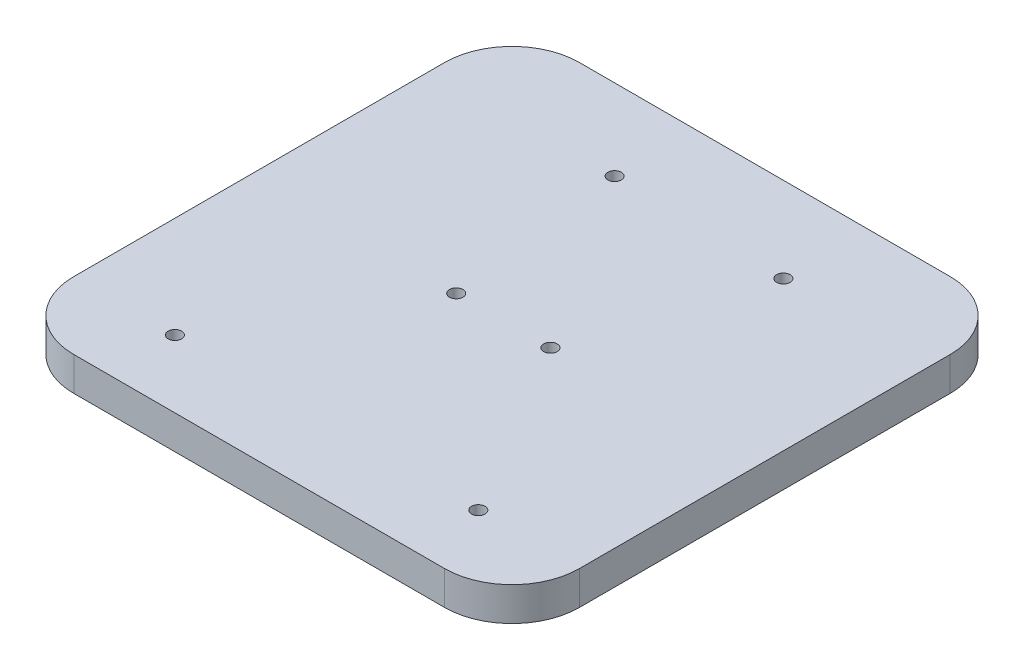
ISO-10303-21;
HEADER;
FILE_DESCRIPTION(('STEP AP214'),'2;1');
FILE_NAME('part.step','',(''),(''),'','','');
FILE_SCHEMA(('AUTOMOTIVE_DESIGN { 1 0 10303 214 1 1 1 1 }'));
ENDSEC;
DATA;
#1=APPLICATION_CONTEXT('core data for automotive mechanical design processes');
#2=APPLICATION_PROTOCOL_DEFINITION('international standard','automotive_design',2000,#1);
#3=PRODUCT_CONTEXT('',#1,'mechanical');
#4=PRODUCT('Part','Part','',(#3));
#5=PRODUCT_RELATED_PRODUCT_CATEGORY('part','',(#4));
#6=PRODUCT_DEFINITION_FORMATION('','',#4);
#7=PRODUCT_DEFINITION_CONTEXT('part definition',#1,'design');
#8=PRODUCT_DEFINITION('design','',#6,#7);
#9=PRODUCT_DEFINITION_SHAPE('','',#8);
#10=(LENGTH_UNIT() NAMED_UNIT(*) SI_UNIT(.MILLI.,.METRE.));
#11=(NAMED_UNIT(*) PLANE_ANGLE_UNIT() SI_UNIT($,.RADIAN.));
#12=(NAMED_UNIT(*) SI_UNIT($,.STERADIAN.) SOLID_ANGLE_UNIT());
#13=UNCERTAINTY_MEASURE_WITH_UNIT(LENGTH_MEASURE(1.E-05),#10,'distance_accuracy_value','');
#14=(GEOMETRIC_REPRESENTATION_CONTEXT(3) GLOBAL_UNCERTAINTY_ASSIGNED_CONTEXT((#13)) GLOBAL_UNIT_ASSIGNED_CONTEXT((#10,
#11,#12)) REPRESENTATION_CONTEXT('',''));
#15=CARTESIAN_POINT('',(0.,0.,0.));
#16=DIRECTION('',(0.,0.,1.));
#17=DIRECTION('',(1.,0.,0.));
#18=AXIS2_PLACEMENT_3D('',#15,#16,#17);
#19=CARTESIAN_POINT('',(30.,10.,-20.));
#20=DIRECTION('',(0.,-1.,0.));
#21=DIRECTION('',(0.,0.,-1.));
#22=AXIS2_PLACEMENT_3D('',#19,#20,#21);
#23=CYLINDRICAL_SURFACE('',#22,2.);
#24=CARTESIAN_POINT('',(30.,10.,-20.));
#25=DIRECTION('',(0.,1.,0.));
#26=DIRECTION('',(0.,0.,1.));
#27=AXIS2_PLACEMENT_3D('',#24,#25,#26);
#28=CIRCLE('',#27,2.);
#29=CARTESIAN_POINT('',(30.,10.,-18.));
#30=VERTEX_POINT('',#29);
#31=EDGE_CURVE('E136',#30,#30,#28,.T.);
#32=ORIENTED_EDGE('',*,*,#31,.T.);
#33=EDGE_LOOP('',(#32));
#34=FACE_BOUND('',#33,.T.);
#35=CARTESIAN_POINT('',(30.,5.,-20.));
#36=DIRECTION('',(0.,-1.,0.));
#37=DIRECTION('',(0.,0.,-1.));
#38=AXIS2_PLACEMENT_3D('',#35,#36,#37);
#39=CIRCLE('',#38,2.);
#40=CARTESIAN_POINT('',(30.,5.,-22.));
#41=VERTEX_POINT('',#40);
#42=EDGE_CURVE('E176',#41,#41,#39,.T.);
#43=ORIENTED_EDGE('',*,*,#42,.T.);
#44=EDGE_LOOP('',(#43));
#45=FACE_BOUND('',#44,.T.);
#46=ADVANCED_FACE('F39',(#34,#45),#23,.F.);
#47=CARTESIAN_POINT('',(120.,10.,-20.));
#48=DIRECTION('',(0.,-1.,0.));
#49=DIRECTION('',(0.,0.,-1.));
#50=AXIS2_PLACEMENT_3D('',#47,#48,#49);
#51=CYLINDRICAL_SURFACE('',#50,2.);
#52=CARTESIAN_POINT('',(120.,10.,-20.));
#53=DIRECTION('',(0.,1.,0.));
#54=DIRECTION('',(0.,0.,1.));
#55=AXIS2_PLACEMENT_3D('',#52,#53,#54);
#56=CIRCLE('',#55,2.);
#57=CARTESIAN_POINT('',(120.,10.,-18.));
#58=VERTEX_POINT('',#57);
#59=EDGE_CURVE('E144',#58,#58,#56,.T.);
#60=ORIENTED_EDGE('',*,*,#59,.T.);
#61=EDGE_LOOP('',(#60));
#62=FACE_BOUND('',#61,.T.);
#63=CARTESIAN_POINT('',(120.,5.,-20.));
#64=DIRECTION('',(0.,-1.,0.));
#65=DIRECTION('',(0.,0.,-1.));
#66=AXIS2_PLACEMENT_3D('',#63,#64,#65);
#67=CIRCLE('',#66,2.);
#68=CARTESIAN_POINT('',(120.,5.,-22.));
#69=VERTEX_POINT('',#68);
#70=EDGE_CURVE('E172',#69,#69,#67,.T.);
#71=ORIENTED_EDGE('',*,*,#70,.T.);
#72=EDGE_LOOP('',(#71));
#73=FACE_BOUND('',#72,.T.);
#74=ADVANCED_FACE('F342',(#62,#73),#51,.F.);
#75=CARTESIAN_POINT('',(61.03,10.,-72.42));
#76=DIRECTION('',(0.,-1.,0.));
#77=DIRECTION('',(0.,0.,-1.));
#78=AXIS2_PLACEMENT_3D('',#75,#76,#77);
#79=CYLINDRICAL_SURFACE('',#78,2.);
#80=CARTESIAN_POINT('',(61.03,10.,-72.42));
#81=DIRECTION('',(0.,1.,0.));
#82=DIRECTION('',(0.,0.,1.));
#83=AXIS2_PLACEMENT_3D('',#80,#81,#82);
#84=CIRCLE('',#83,2.);
#85=CARTESIAN_POINT('',(61.03,10.,-70.42));
#86=VERTEX_POINT('',#85);
#87=EDGE_CURVE('E239',#86,#86,#84,.T.);
#88=ORIENTED_EDGE('',*,*,#87,.T.);
#89=EDGE_LOOP('',(#88));
#90=FACE_BOUND('',#89,.T.);
#91=CARTESIAN_POINT('',(61.03,5.,-72.42));
#92=DIRECTION('',(0.,-1.,0.));
#93=DIRECTION('',(0.,0.,-1.));
#94=AXIS2_PLACEMENT_3D('',#91,#92,#93);
#95=CIRCLE('',#94,2.);
#96=CARTESIAN_POINT('',(61.03,5.,-74.42));
#97=VERTEX_POINT('',#96);
#98=EDGE_CURVE('E168',#97,#97,#95,.T.);
#99=ORIENTED_EDGE('',*,*,#98,.T.);
#100=EDGE_LOOP('',(#99));
#101=FACE_BOUND('',#100,.T.);
#102=ADVANCED_FACE('F348',(#90,#101),#79,.F.);
#103=CARTESIAN_POINT('',(88.97,10.,-72.42));
#104=DIRECTION('',(0.,-1.,0.));
#105=DIRECTION('',(0.,0.,-1.));
#106=AXIS2_PLACEMENT_3D('',#103,#104,#105);
#107=CYLINDRICAL_SURFACE('',#106,2.);
#108=CARTESIAN_POINT('',(88.97,10.,-72.42));
#109=DIRECTION('',(0.,1.,0.));
#110=DIRECTION('',(0.,0.,1.));
#111=AXIS2_PLACEMENT_3D('',#108,#109,#110);
#112=CIRCLE('',#111,2.);
#113=CARTESIAN_POINT('',(88.97,10.,-70.42));
#114=VERTEX_POINT('',#113);
#115=EDGE_CURVE('E243',#114,#114,#112,.T.);
#116=ORIENTED_EDGE('',*,*,#115,.T.);
#117=EDGE_LOOP('',(#116));
#118=FACE_BOUND('',#117,.T.);
#119=CARTESIAN_POINT('',(88.97,5.,-72.42));
#120=DIRECTION('',(0.,-1.,0.));
#121=DIRECTION('',(0.,0.,-1.));
#122=AXIS2_PLACEMENT_3D('',#119,#120,#121);
#123=CIRCLE('',#122,2.);
#124=CARTESIAN_POINT('',(88.97,5.,-74.42));
#125=VERTEX_POINT('',#124);
#126=EDGE_CURVE('E164',#125,#125,#123,.T.);
#127=ORIENTED_EDGE('',*,*,#126,.T.);
#128=EDGE_LOOP('',(#127));
#129=FACE_BOUND('',#128,.T.);
#130=ADVANCED_FACE('F416',(#118,#129),#107,.F.);
#131=CARTESIAN_POINT('',(105.74,10.,-124.76));
#132=DIRECTION('',(0.,-1.,0.));
#133=DIRECTION('',(0.,0.,-1.));
#134=AXIS2_PLACEMENT_3D('',#131,#132,#133);
#135=CYLINDRICAL_SURFACE('',#134,1.99999999999998);
#136=CARTESIAN_POINT('',(105.74,10.,-124.76));
#137=DIRECTION('',(0.,1.,0.));
#138=DIRECTION('',(0.,0.,1.));
#139=AXIS2_PLACEMENT_3D('',#136,#137,#138);
#140=CIRCLE('',#139,1.99999999999998);
#141=CARTESIAN_POINT('',(105.74,10.,-122.76));
#142=VERTEX_POINT('',#141);
#143=EDGE_CURVE('E247',#142,#142,#140,.T.);
#144=ORIENTED_EDGE('',*,*,#143,.T.);
#145=EDGE_LOOP('',(#144));
#146=FACE_BOUND('',#145,.T.);
#147=CARTESIAN_POINT('',(105.74,5.,-124.76));
#148=DIRECTION('',(0.,-1.,0.));
#149=DIRECTION('',(0.,0.,-1.));
#150=AXIS2_PLACEMENT_3D('',#147,#148,#149);
#151=CIRCLE('',#150,1.99999999999998);
#152=CARTESIAN_POINT('',(105.74,5.,-126.76));
#153=VERTEX_POINT('',#152);
#154=EDGE_CURVE('E159',#153,#153,#151,.T.);
#155=ORIENTED_EDGE('',*,*,#154,.T.);
#156=EDGE_LOOP('',(#155));
#157=FACE_BOUND('',#156,.T.);
#158=ADVANCED_FACE('F396',(#146,#157),#135,.F.);
#159=CARTESIAN_POINT('',(54.4,10.,-126.03));
#160=DIRECTION('',(0.,-1.,0.));
#161=DIRECTION('',(0.,0.,-1.));
#162=AXIS2_PLACEMENT_3D('',#159,#160,#161);
#163=CYLINDRICAL_SURFACE('',#162,2.);
#164=CARTESIAN_POINT('',(54.4,10.,-126.03));
#165=DIRECTION('',(0.,1.,0.));
#166=DIRECTION('',(0.,0.,1.));
#167=AXIS2_PLACEMENT_3D('',#164,#165,#166);
#168=CIRCLE('',#167,2.);
#169=CARTESIAN_POINT('',(54.4,10.,-124.03));
#170=VERTEX_POINT('',#169);
#171=EDGE_CURVE('E180',#170,#170,#168,.T.);
#172=ORIENTED_EDGE('',*,*,#171,.T.);
#173=EDGE_LOOP('',(#172));
#174=FACE_BOUND('',#173,.T.);
#175=CARTESIAN_POINT('',(54.4,5.,-126.03));
#176=DIRECTION('',(0.,-1.,0.));
#177=DIRECTION('',(0.,0.,-1.));
#178=AXIS2_PLACEMENT_3D('',#175,#176,#177);
#179=CIRCLE('',#178,2.);
#180=CARTESIAN_POINT('',(54.4,5.,-128.03));
#181=VERTEX_POINT('',#180);
#182=EDGE_CURVE('E155',#181,#181,#179,.T.);
#183=ORIENTED_EDGE('',*,*,#182,.T.);
#184=EDGE_LOOP('',(#183));
#185=FACE_BOUND('',#184,.T.);
#186=ADVANCED_FACE('F355',(#174,#185),#163,.F.);
#187=CARTESIAN_POINT('',(0.,10.,0.));
#188=DIRECTION('',(0.,-1.,0.));
#189=DIRECTION('',(0.,0.,-1.));
#190=AXIS2_PLACEMENT_3D('',#187,#188,#189);
#191=PLANE('',#190);
#192=DIRECTION('',(-1.,0.,0.));
#193=VECTOR('',#192,1.);
#194=CARTESIAN_POINT('',(0.,10.,-150.));
#195=LINE('',#194,#193);
#196=CARTESIAN_POINT('',(130.,10.,-150.));
#197=VERTEX_POINT('',#196);
#198=CARTESIAN_POINT('',(20.,10.,-150.));
#199=VERTEX_POINT('',#198);
#200=EDGE_CURVE('E147',#197,#199,#195,.T.);
#201=ORIENTED_EDGE('',*,*,#200,.T.);
#202=CARTESIAN_POINT('',(20.,10.,-130.));
#203=DIRECTION('',(0.,-1.,0.));
#204=DIRECTION('',(0.,0.,-1.));
#205=AXIS2_PLACEMENT_3D('',#202,#203,#204);
#206=CIRCLE('',#205,20.);
#207=CARTESIAN_POINT('',(0.,10.,-130.));
#208=VERTEX_POINT('',#207);
#209=EDGE_CURVE('E203',#199,#208,#206,.F.);
#210=ORIENTED_EDGE('',*,*,#209,.T.);
#211=DIRECTION('',(0.,0.,1.));
#212=VECTOR('',#211,1.);
#213=CARTESIAN_POINT('',(0.,10.,0.));
#214=LINE('',#213,#212);
#215=CARTESIAN_POINT('',(0.,10.,-20.));
#216=VERTEX_POINT('',#215);
#217=EDGE_CURVE('E127',#208,#216,#214,.T.);
#218=ORIENTED_EDGE('',*,*,#217,.T.);
#219=CARTESIAN_POINT('',(20.,10.,-20.));
#220=DIRECTION('',(0.,-1.,0.));
#221=DIRECTION('',(0.,0.,-1.));
#222=AXIS2_PLACEMENT_3D('',#219,#220,#221);
#223=CIRCLE('',#222,20.);
#224=CARTESIAN_POINT('',(20.,10.,0.));
#225=VERTEX_POINT('',#224);
#226=EDGE_CURVE('E195',#216,#225,#223,.F.);
#227=ORIENTED_EDGE('',*,*,#226,.T.);
#228=DIRECTION('',(1.,0.,0.));
#229=VECTOR('',#228,1.);
#230=CARTESIAN_POINT('',(0.,10.,0.));
#231=LINE('',#230,#229);
#232=CARTESIAN_POINT('',(130.,10.,0.));
#233=VERTEX_POINT('',#232);
#234=EDGE_CURVE('E218',#225,#233,#231,.T.);
#235=ORIENTED_EDGE('',*,*,#234,.T.);
#236=CARTESIAN_POINT('',(130.,10.,-20.));
#237=DIRECTION('',(0.,-1.,0.));
#238=DIRECTION('',(0.,0.,-1.));
#239=AXIS2_PLACEMENT_3D('',#236,#237,#238);
#240=CIRCLE('',#239,20.);
#241=CARTESIAN_POINT('',(150.,10.,-20.));
#242=VERTEX_POINT('',#241);
#243=EDGE_CURVE('E62',#233,#242,#240,.F.);
#244=ORIENTED_EDGE('',*,*,#243,.T.);
#245=DIRECTION('',(0.,0.,-1.));
#246=VECTOR('',#245,1.);
#247=CARTESIAN_POINT('',(150.,10.,0.));
#248=LINE('',#247,#246);
#249=CARTESIAN_POINT('',(150.,10.,-130.));
#250=VERTEX_POINT('',#249);
#251=EDGE_CURVE('E226',#242,#250,#248,.T.);
#252=ORIENTED_EDGE('',*,*,#251,.T.);
#253=CARTESIAN_POINT('',(130.,10.,-130.));
#254=DIRECTION('',(0.,-1.,0.));
#255=DIRECTION('',(0.,0.,-1.));
#256=AXIS2_PLACEMENT_3D('',#253,#254,#255);
#257=CIRCLE('',#256,20.);
#258=EDGE_CURVE('E200',#250,#197,#257,.F.);
#259=ORIENTED_EDGE('',*,*,#258,.T.);
#260=EDGE_LOOP('',(#201,#210,#218,#227,#235,#244,#252,#259));
#261=FACE_BOUND('',#260,.T.);
#262=ORIENTED_EDGE('',*,*,#31,.F.);
#263=EDGE_LOOP('',(#262));
#264=FACE_BOUND('',#263,.T.);
#265=ORIENTED_EDGE('',*,*,#59,.F.);
#266=EDGE_LOOP('',(#265));
#267=FACE_BOUND('',#266,.T.);
#268=ORIENTED_EDGE('',*,*,#87,.F.);
#269=EDGE_LOOP('',(#268));
#270=FACE_BOUND('',#269,.T.);
#271=ORIENTED_EDGE('',*,*,#115,.F.);
#272=EDGE_LOOP('',(#271));
#273=FACE_BOUND('',#272,.T.);
#274=ORIENTED_EDGE('',*,*,#143,.F.);
#275=EDGE_LOOP('',(#274));
#276=FACE_BOUND('',#275,.T.);
#277=ORIENTED_EDGE('',*,*,#171,.F.);
#278=EDGE_LOOP('',(#277));
#279=FACE_BOUND('',#278,.T.);
#280=ADVANCED_FACE('F313',(#261,#264,#267,#270,#273,#276,#279),#191,.F.);
#281=CARTESIAN_POINT('',(0.,0.,0.));
#282=DIRECTION('',(0.,-1.,0.));
#283=DIRECTION('',(0.,0.,-1.));
#284=AXIS2_PLACEMENT_3D('',#281,#282,#283);
#285=PLANE('',#284);
#286=CARTESIAN_POINT('',(30.,0.,-20.));
#287=DIRECTION('',(0.,-1.,0.));
#288=DIRECTION('',(0.,0.,-1.));
#289=AXIS2_PLACEMENT_3D('',#286,#287,#288);
#290=CIRCLE('',#289,4.00000000000001);
#291=CARTESIAN_POINT('',(30.,0.,-24.));
#292=VERTEX_POINT('',#291);
#293=EDGE_CURVE('E287',#292,#292,#290,.T.);
#294=ORIENTED_EDGE('',*,*,#293,.F.);
#295=EDGE_LOOP('',(#294));
#296=FACE_BOUND('',#295,.T.);
#297=CARTESIAN_POINT('',(105.74,0.,-124.76));
#298=DIRECTION('',(0.,-1.,0.));
#299=DIRECTION('',(0.,0.,-1.));
#300=AXIS2_PLACEMENT_3D('',#297,#298,#299);
#301=CIRCLE('',#300,4.00000000000001);
#302=CARTESIAN_POINT('',(105.74,0.,-128.76));
#303=VERTEX_POINT('',#302);
#304=EDGE_CURVE('E288',#303,#303,#301,.T.);
#305=ORIENTED_EDGE('',*,*,#304,.F.);
#306=EDGE_LOOP('',(#305));
#307=FACE_BOUND('',#306,.T.);
#308=CARTESIAN_POINT('',(54.4,0.,-126.03));
#309=DIRECTION('',(0.,-1.,0.));
#310=DIRECTION('',(0.,0.,-1.));
#311=AXIS2_PLACEMENT_3D('',#308,#309,#310);
#312=CIRCLE('',#311,4.00000000000001);
#313=CARTESIAN_POINT('',(54.4,0.,-130.03));
#314=VERTEX_POINT('',#313);
#315=EDGE_CURVE('E254',#314,#314,#312,.T.);
#316=ORIENTED_EDGE('',*,*,#315,.F.);
#317=EDGE_LOOP('',(#316));
#318=FACE_BOUND('',#317,.T.);
#319=CARTESIAN_POINT('',(61.03,0.,-72.42));
#320=DIRECTION('',(0.,-1.,0.));
#321=DIRECTION('',(0.,0.,-1.));
#322=AXIS2_PLACEMENT_3D('',#319,#320,#321);
#323=CIRCLE('',#322,4.);
#324=CARTESIAN_POINT('',(61.03,0.,-76.42));
#325=VERTEX_POINT('',#324);
#326=EDGE_CURVE('E263',#325,#325,#323,.T.);
#327=ORIENTED_EDGE('',*,*,#326,.F.);
#328=EDGE_LOOP('',(#327));
#329=FACE_BOUND('',#328,.T.);
#330=CARTESIAN_POINT('',(88.97,0.,-72.42));
#331=DIRECTION('',(0.,-1.,0.));
#332=DIRECTION('',(0.,0.,-1.));
#333=AXIS2_PLACEMENT_3D('',#330,#331,#332);
#334=CIRCLE('',#333,4.00000000000001);
#335=CARTESIAN_POINT('',(88.97,0.,-76.42));
#336=VERTEX_POINT('',#335);
#337=EDGE_CURVE('E271',#336,#336,#334,.T.);
#338=ORIENTED_EDGE('',*,*,#337,.F.);
#339=EDGE_LOOP('',(#338));
#340=FACE_BOUND('',#339,.T.);
#341=CARTESIAN_POINT('',(120.,0.,-20.));
#342=DIRECTION('',(0.,-1.,0.));
#343=DIRECTION('',(0.,0.,-1.));
#344=AXIS2_PLACEMENT_3D('',#341,#342,#343);
#345=CIRCLE('',#344,4.00000000000001);
#346=CARTESIAN_POINT('',(120.,0.,-24.));
#347=VERTEX_POINT('',#346);
#348=EDGE_CURVE('E279',#347,#347,#345,.T.);
#349=ORIENTED_EDGE('',*,*,#348,.F.);
#350=EDGE_LOOP('',(#349));
#351=FACE_BOUND('',#350,.T.);
#352=DIRECTION('',(0.,0.,1.));
#353=VECTOR('',#352,1.);
#354=CARTESIAN_POINT('',(0.,0.,0.));
#355=LINE('',#354,#353);
#356=CARTESIAN_POINT('',(0.,0.,-130.));
#357=VERTEX_POINT('',#356);
#358=CARTESIAN_POINT('',(0.,0.,-20.));
#359=VERTEX_POINT('',#358);
#360=EDGE_CURVE('E124',#357,#359,#355,.T.);
#361=ORIENTED_EDGE('',*,*,#360,.F.);
#362=CARTESIAN_POINT('',(20.,0.,-130.));
#363=DIRECTION('',(0.,-1.,0.));
#364=DIRECTION('',(0.,0.,-1.));
#365=AXIS2_PLACEMENT_3D('',#362,#363,#364);
#366=CIRCLE('',#365,20.);
#367=CARTESIAN_POINT('',(20.,0.,-150.));
#368=VERTEX_POINT('',#367);
#369=EDGE_CURVE('E106',#357,#368,#366,.T.);
#370=ORIENTED_EDGE('',*,*,#369,.T.);
#371=DIRECTION('',(-1.,0.,0.));
#372=VECTOR('',#371,1.);
#373=CARTESIAN_POINT('',(0.,0.,-150.));
#374=LINE('',#373,#372);
#375=CARTESIAN_POINT('',(130.,0.,-150.));
#376=VERTEX_POINT('',#375);
#377=EDGE_CURVE('E152',#376,#368,#374,.T.);
#378=ORIENTED_EDGE('',*,*,#377,.F.);
#379=CARTESIAN_POINT('',(130.,0.,-130.));
#380=DIRECTION('',(0.,-1.,0.));
#381=DIRECTION('',(0.,0.,-1.));
#382=AXIS2_PLACEMENT_3D('',#379,#380,#381);
#383=CIRCLE('',#382,20.);
#384=CARTESIAN_POINT('',(150.,0.,-130.));
#385=VERTEX_POINT('',#384);
#386=EDGE_CURVE('E118',#376,#385,#383,.T.);
#387=ORIENTED_EDGE('',*,*,#386,.T.);
#388=DIRECTION('',(0.,0.,-1.));
#389=VECTOR('',#388,1.);
#390=CARTESIAN_POINT('',(150.,0.,0.));
#391=LINE('',#390,#389);
#392=CARTESIAN_POINT('',(150.,0.,-20.));
#393=VERTEX_POINT('',#392);
#394=EDGE_CURVE('E141',#393,#385,#391,.T.);
#395=ORIENTED_EDGE('',*,*,#394,.F.);
#396=CARTESIAN_POINT('',(130.,0.,-20.));
#397=DIRECTION('',(0.,-1.,0.));
#398=DIRECTION('',(0.,0.,-1.));
#399=AXIS2_PLACEMENT_3D('',#396,#397,#398);
#400=CIRCLE('',#399,20.);
#401=CARTESIAN_POINT('',(130.,0.,0.));
#402=VERTEX_POINT('',#401);
#403=EDGE_CURVE('E185',#393,#402,#400,.T.);
#404=ORIENTED_EDGE('',*,*,#403,.T.);
#405=DIRECTION('',(1.,0.,0.));
#406=VECTOR('',#405,1.);
#407=CARTESIAN_POINT('',(0.,0.,0.));
#408=LINE('',#407,#406);
#409=CARTESIAN_POINT('',(20.,0.,0.));
#410=VERTEX_POINT('',#409);
#411=EDGE_CURVE('E135',#410,#402,#408,.T.);
#412=ORIENTED_EDGE('',*,*,#411,.F.);
#413=CARTESIAN_POINT('',(20.,0.,-20.));
#414=DIRECTION('',(0.,-1.,0.));
#415=DIRECTION('',(0.,0.,-1.));
#416=AXIS2_PLACEMENT_3D('',#413,#414,#415);
#417=CIRCLE('',#416,20.);
#418=EDGE_CURVE('E129',#410,#359,#417,.T.);
#419=ORIENTED_EDGE('',*,*,#418,.T.);
#420=EDGE_LOOP('',(#361,#370,#378,#387,#395,#404,#412,#419));
#421=FACE_BOUND('',#420,.T.);
#422=ADVANCED_FACE('F132',(#296,#307,#318,#329,#340,#351,#421),#285,.T.);
#423=CARTESIAN_POINT('',(0.,10.,0.));
#424=DIRECTION('',(1.,0.,0.));
#425=DIRECTION('',(0.,0.,-1.));
#426=AXIS2_PLACEMENT_3D('',#423,#424,#425);
#427=PLANE('',#426);
#428=ORIENTED_EDGE('',*,*,#217,.F.);
#429=DIRECTION('',(0.,-1.,0.));
#430=VECTOR('',#429,1.);
#431=CARTESIAN_POINT('',(0.,10.,-130.));
#432=LINE('',#431,#430);
#433=EDGE_CURVE('E110',#208,#357,#432,.T.);
#434=ORIENTED_EDGE('',*,*,#433,.T.);
#435=ORIENTED_EDGE('',*,*,#360,.T.);
#436=DIRECTION('',(0.,-1.,0.));
#437=VECTOR('',#436,1.);
#438=CARTESIAN_POINT('',(0.,10.,-20.));
#439=LINE('',#438,#437);
#440=EDGE_CURVE('E130',#359,#216,#439,.F.);
#441=ORIENTED_EDGE('',*,*,#440,.T.);
#442=EDGE_LOOP('',(#428,#434,#435,#441));
#443=FACE_BOUND('',#442,.T.);
#444=ADVANCED_FACE('F123',(#443),#427,.F.);
#445=CARTESIAN_POINT('',(0.,10.,0.));
#446=DIRECTION('',(0.,0.,-1.));
#447=DIRECTION('',(-1.,0.,0.));
#448=AXIS2_PLACEMENT_3D('',#445,#446,#447);
#449=PLANE('',#448);
#450=ORIENTED_EDGE('',*,*,#411,.T.);
#451=DIRECTION('',(0.,-1.,0.));
#452=VECTOR('',#451,1.);
#453=CARTESIAN_POINT('',(130.,10.,0.));
#454=LINE('',#453,#452);
#455=EDGE_CURVE('E11',#402,#233,#454,.F.);
#456=ORIENTED_EDGE('',*,*,#455,.T.);
#457=ORIENTED_EDGE('',*,*,#234,.F.);
#458=DIRECTION('',(0.,-1.,0.));
#459=VECTOR('',#458,1.);
#460=CARTESIAN_POINT('',(20.,10.,0.));
#461=LINE('',#460,#459);
#462=EDGE_CURVE('E48',#225,#410,#461,.T.);
#463=ORIENTED_EDGE('',*,*,#462,.T.);
#464=EDGE_LOOP('',(#450,#456,#457,#463));
#465=FACE_BOUND('',#464,.T.);
#466=ADVANCED_FACE('F216',(#465),#449,.F.);
#467=CARTESIAN_POINT('',(150.,10.,0.));
#468=DIRECTION('',(-1.,0.,0.));
#469=DIRECTION('',(0.,0.,1.));
#470=AXIS2_PLACEMENT_3D('',#467,#468,#469);
#471=PLANE('',#470);
#472=ORIENTED_EDGE('',*,*,#394,.T.);
#473=DIRECTION('',(0.,-1.,0.));
#474=VECTOR('',#473,1.);
#475=CARTESIAN_POINT('',(150.,10.,-130.));
#476=LINE('',#475,#474);
#477=EDGE_CURVE('E55',#385,#250,#476,.F.);
#478=ORIENTED_EDGE('',*,*,#477,.T.);
#479=ORIENTED_EDGE('',*,*,#251,.F.);
#480=DIRECTION('',(0.,-1.,0.));
#481=VECTOR('',#480,1.);
#482=CARTESIAN_POINT('',(150.,10.,-20.));
#483=LINE('',#482,#481);
#484=EDGE_CURVE('E206',#242,#393,#483,.T.);
#485=ORIENTED_EDGE('',*,*,#484,.T.);
#486=EDGE_LOOP('',(#472,#478,#479,#485));
#487=FACE_BOUND('',#486,.T.);
#488=ADVANCED_FACE('F225',(#487),#471,.F.);
#489=CARTESIAN_POINT('',(0.,10.,-150.));
#490=DIRECTION('',(0.,0.,1.));
#491=DIRECTION('',(1.,0.,0.));
#492=AXIS2_PLACEMENT_3D('',#489,#490,#491);
#493=PLANE('',#492);
#494=ORIENTED_EDGE('',*,*,#377,.T.);
#495=DIRECTION('',(0.,-1.,0.));
#496=VECTOR('',#495,1.);
#497=CARTESIAN_POINT('',(20.,10.,-150.));
#498=LINE('',#497,#496);
#499=EDGE_CURVE('E111',#368,#199,#498,.F.);
#500=ORIENTED_EDGE('',*,*,#499,.T.);
#501=ORIENTED_EDGE('',*,*,#200,.F.);
#502=DIRECTION('',(0.,-1.,0.));
#503=VECTOR('',#502,1.);
#504=CARTESIAN_POINT('',(130.,10.,-150.));
#505=LINE('',#504,#503);
#506=EDGE_CURVE('E117',#197,#376,#505,.T.);
#507=ORIENTED_EDGE('',*,*,#506,.T.);
#508=EDGE_LOOP('',(#494,#500,#501,#507));
#509=FACE_BOUND('',#508,.T.);
#510=ADVANCED_FACE('F357',(#509),#493,.F.);
#511=CARTESIAN_POINT('',(54.4,5.,-126.03));
#512=DIRECTION('',(0.,-1.,0.));
#513=DIRECTION('',(0.,0.,-1.));
#514=AXIS2_PLACEMENT_3D('',#511,#512,#513);
#515=CYLINDRICAL_SURFACE('',#514,4.00000000000001);
#516=CARTESIAN_POINT('',(54.4,5.,-126.03));
#517=DIRECTION('',(0.,-1.,0.));
#518=DIRECTION('',(0.,0.,-1.));
#519=AXIS2_PLACEMENT_3D('',#516,#517,#518);
#520=CIRCLE('',#519,4.00000000000001);
#521=CARTESIAN_POINT('',(54.4,5.,-130.03));
#522=VERTEX_POINT('',#521);
#523=EDGE_CURVE('E258',#522,#522,#520,.T.);
#524=ORIENTED_EDGE('',*,*,#523,.F.);
#525=EDGE_LOOP('',(#524));
#526=FACE_BOUND('',#525,.T.);
#527=ORIENTED_EDGE('',*,*,#315,.T.);
#528=EDGE_LOOP('',(#527));
#529=FACE_BOUND('',#528,.T.);
#530=ADVANCED_FACE('F360',(#526,#529),#515,.F.);
#531=CARTESIAN_POINT('',(54.4,5.,-126.03));
#532=DIRECTION('',(0.,-1.,0.));
#533=DIRECTION('',(0.,0.,-1.));
#534=AXIS2_PLACEMENT_3D('',#531,#532,#533);
#535=PLANE('',#534);
#536=ORIENTED_EDGE('',*,*,#182,.F.);
#537=EDGE_LOOP('',(#536));
#538=FACE_BOUND('',#537,.T.);
#539=ORIENTED_EDGE('',*,*,#523,.T.);
#540=EDGE_LOOP('',(#539));
#541=FACE_BOUND('',#540,.T.);
#542=ADVANCED_FACE('F400',(#538,#541),#535,.T.);
#543=CARTESIAN_POINT('',(105.74,5.,-124.76));
#544=DIRECTION('',(0.,-1.,0.));
#545=DIRECTION('',(0.,0.,-1.));
#546=AXIS2_PLACEMENT_3D('',#543,#544,#545);
#547=CYLINDRICAL_SURFACE('',#546,4.00000000000001);
#548=CARTESIAN_POINT('',(105.74,5.,-124.76));
#549=DIRECTION('',(0.,-1.,0.));
#550=DIRECTION('',(0.,0.,-1.));
#551=AXIS2_PLACEMENT_3D('',#548,#549,#550);
#552=CIRCLE('',#551,4.00000000000001);
#553=CARTESIAN_POINT('',(105.74,5.,-128.76));
#554=VERTEX_POINT('',#553);
#555=EDGE_CURVE('E259',#554,#554,#552,.T.);
#556=ORIENTED_EDGE('',*,*,#555,.F.);
#557=EDGE_LOOP('',(#556));
#558=FACE_BOUND('',#557,.T.);
#559=ORIENTED_EDGE('',*,*,#304,.T.);
#560=EDGE_LOOP('',(#559));
#561=FACE_BOUND('',#560,.T.);
#562=ADVANCED_FACE('F403',(#558,#561),#547,.F.);
#563=CARTESIAN_POINT('',(105.74,5.,-124.76));
#564=DIRECTION('',(0.,-1.,0.));
#565=DIRECTION('',(0.,0.,-1.));
#566=AXIS2_PLACEMENT_3D('',#563,#564,#565);
#567=PLANE('',#566);
#568=ORIENTED_EDGE('',*,*,#154,.F.);
#569=EDGE_LOOP('',(#568));
#570=FACE_BOUND('',#569,.T.);
#571=ORIENTED_EDGE('',*,*,#555,.T.);
#572=EDGE_LOOP('',(#571));
#573=FACE_BOUND('',#572,.T.);
#574=ADVANCED_FACE('F439',(#570,#573),#567,.T.);
#575=CARTESIAN_POINT('',(88.97,5.,-72.42));
#576=DIRECTION('',(0.,-1.,0.));
#577=DIRECTION('',(0.,0.,-1.));
#578=AXIS2_PLACEMENT_3D('',#575,#576,#577);
#579=CYLINDRICAL_SURFACE('',#578,4.00000000000001);
#580=CARTESIAN_POINT('',(88.97,5.,-72.42));
#581=DIRECTION('',(0.,-1.,0.));
#582=DIRECTION('',(0.,0.,-1.));
#583=AXIS2_PLACEMENT_3D('',#580,#581,#582);
#584=CIRCLE('',#583,4.00000000000001);
#585=CARTESIAN_POINT('',(88.97,5.,-76.42));
#586=VERTEX_POINT('',#585);
#587=EDGE_CURVE('E275',#586,#586,#584,.T.);
#588=ORIENTED_EDGE('',*,*,#587,.F.);
#589=EDGE_LOOP('',(#588));
#590=FACE_BOUND('',#589,.T.);
#591=ORIENTED_EDGE('',*,*,#337,.T.);
#592=EDGE_LOOP('',(#591));
#593=FACE_BOUND('',#592,.T.);
#594=ADVANCED_FACE('F435',(#590,#593),#579,.F.);
#595=CARTESIAN_POINT('',(88.97,5.,-72.42));
#596=DIRECTION('',(0.,-1.,0.));
#597=DIRECTION('',(0.,0.,-1.));
#598=AXIS2_PLACEMENT_3D('',#595,#596,#597);
#599=PLANE('',#598);
#600=ORIENTED_EDGE('',*,*,#126,.F.);
#601=EDGE_LOOP('',(#600));
#602=FACE_BOUND('',#601,.T.);
#603=ORIENTED_EDGE('',*,*,#587,.T.);
#604=EDGE_LOOP('',(#603));
#605=FACE_BOUND('',#604,.T.);
#606=ADVANCED_FACE('F431',(#602,#605),#599,.T.);
#607=CARTESIAN_POINT('',(61.03,5.,-72.42));
#608=DIRECTION('',(0.,-1.,0.));
#609=DIRECTION('',(0.,0.,-1.));
#610=AXIS2_PLACEMENT_3D('',#607,#608,#609);
#611=CYLINDRICAL_SURFACE('',#610,4.);
#612=CARTESIAN_POINT('',(61.03,5.,-72.42));
#613=DIRECTION('',(0.,-1.,0.));
#614=DIRECTION('',(0.,0.,-1.));
#615=AXIS2_PLACEMENT_3D('',#612,#613,#614);
#616=CIRCLE('',#615,4.);
#617=CARTESIAN_POINT('',(61.03,5.,-76.42));
#618=VERTEX_POINT('',#617);
#619=EDGE_CURVE('E267',#618,#618,#616,.T.);
#620=ORIENTED_EDGE('',*,*,#619,.F.);
#621=EDGE_LOOP('',(#620));
#622=FACE_BOUND('',#621,.T.);
#623=ORIENTED_EDGE('',*,*,#326,.T.);
#624=EDGE_LOOP('',(#623));
#625=FACE_BOUND('',#624,.T.);
#626=ADVANCED_FACE('F336',(#622,#625),#611,.F.);
#627=CARTESIAN_POINT('',(61.03,5.,-72.42));
#628=DIRECTION('',(0.,-1.,0.));
#629=DIRECTION('',(0.,0.,-1.));
#630=AXIS2_PLACEMENT_3D('',#627,#628,#629);
#631=PLANE('',#630);
#632=ORIENTED_EDGE('',*,*,#98,.F.);
#633=EDGE_LOOP('',(#632));
#634=FACE_BOUND('',#633,.T.);
#635=ORIENTED_EDGE('',*,*,#619,.T.);
#636=EDGE_LOOP('',(#635));
#637=FACE_BOUND('',#636,.T.);
#638=ADVANCED_FACE('F327',(#634,#637),#631,.T.);
#639=CARTESIAN_POINT('',(120.,5.,-20.));
#640=DIRECTION('',(0.,-1.,0.));
#641=DIRECTION('',(0.,0.,-1.));
#642=AXIS2_PLACEMENT_3D('',#639,#640,#641);
#643=CYLINDRICAL_SURFACE('',#642,4.00000000000001);
#644=CARTESIAN_POINT('',(120.,5.,-20.));
#645=DIRECTION('',(0.,-1.,0.));
#646=DIRECTION('',(0.,0.,-1.));
#647=AXIS2_PLACEMENT_3D('',#644,#645,#646);
#648=CIRCLE('',#647,4.00000000000001);
#649=CARTESIAN_POINT('',(120.,5.,-24.));
#650=VERTEX_POINT('',#649);
#651=EDGE_CURVE('E283',#650,#650,#648,.T.);
#652=ORIENTED_EDGE('',*,*,#651,.F.);
#653=EDGE_LOOP('',(#652));
#654=FACE_BOUND('',#653,.T.);
#655=ORIENTED_EDGE('',*,*,#348,.T.);
#656=EDGE_LOOP('',(#655));
#657=FACE_BOUND('',#656,.T.);
#658=ADVANCED_FACE('F325',(#654,#657),#643,.F.);
#659=CARTESIAN_POINT('',(120.,5.,-20.));
#660=DIRECTION('',(0.,-1.,0.));
#661=DIRECTION('',(0.,0.,-1.));
#662=AXIS2_PLACEMENT_3D('',#659,#660,#661);
#663=PLANE('',#662);
#664=ORIENTED_EDGE('',*,*,#70,.F.);
#665=EDGE_LOOP('',(#664));
#666=FACE_BOUND('',#665,.T.);
#667=ORIENTED_EDGE('',*,*,#651,.T.);
#668=EDGE_LOOP('',(#667));
#669=FACE_BOUND('',#668,.T.);
#670=ADVANCED_FACE('F307',(#666,#669),#663,.T.);
#671=CARTESIAN_POINT('',(30.,5.,-20.));
#672=DIRECTION('',(0.,-1.,0.));
#673=DIRECTION('',(0.,0.,-1.));
#674=AXIS2_PLACEMENT_3D('',#671,#672,#673);
#675=CYLINDRICAL_SURFACE('',#674,4.00000000000001);
#676=CARTESIAN_POINT('',(30.,5.,-20.));
#677=DIRECTION('',(0.,-1.,0.));
#678=DIRECTION('',(0.,0.,-1.));
#679=AXIS2_PLACEMENT_3D('',#676,#677,#678);
#680=CIRCLE('',#679,4.00000000000001);
#681=CARTESIAN_POINT('',(30.,5.,-24.));
#682=VERTEX_POINT('',#681);
#683=EDGE_CURVE('E160',#682,#682,#680,.T.);
#684=ORIENTED_EDGE('',*,*,#683,.F.);
#685=EDGE_LOOP('',(#684));
#686=FACE_BOUND('',#685,.T.);
#687=ORIENTED_EDGE('',*,*,#293,.T.);
#688=EDGE_LOOP('',(#687));
#689=FACE_BOUND('',#688,.T.);
#690=ADVANCED_FACE('F304',(#686,#689),#675,.F.);
#691=CARTESIAN_POINT('',(30.,5.,-20.));
#692=DIRECTION('',(0.,-1.,0.));
#693=DIRECTION('',(0.,0.,-1.));
#694=AXIS2_PLACEMENT_3D('',#691,#692,#693);
#695=PLANE('',#694);
#696=ORIENTED_EDGE('',*,*,#42,.F.);
#697=EDGE_LOOP('',(#696));
#698=FACE_BOUND('',#697,.T.);
#699=ORIENTED_EDGE('',*,*,#683,.T.);
#700=EDGE_LOOP('',(#699));
#701=FACE_BOUND('',#700,.T.);
#702=ADVANCED_FACE('F302',(#698,#701),#695,.T.);
#703=CARTESIAN_POINT('',(20.,10.,-130.));
#704=DIRECTION('',(0.,-1.,0.));
#705=DIRECTION('',(0.,0.,-1.));
#706=AXIS2_PLACEMENT_3D('',#703,#704,#705);
#707=CYLINDRICAL_SURFACE('',#706,20.);
#708=ORIENTED_EDGE('',*,*,#209,.F.);
#709=ORIENTED_EDGE('',*,*,#499,.F.);
#710=ORIENTED_EDGE('',*,*,#369,.F.);
#711=ORIENTED_EDGE('',*,*,#433,.F.);
#712=EDGE_LOOP('',(#708,#709,#710,#711));
#713=FACE_BOUND('',#712,.T.);
#714=ADVANCED_FACE('F109',(#713),#707,.T.);
#715=CARTESIAN_POINT('',(130.,10.,-130.));
#716=DIRECTION('',(0.,-1.,0.));
#717=DIRECTION('',(0.,0.,-1.));
#718=AXIS2_PLACEMENT_3D('',#715,#716,#717);
#719=CYLINDRICAL_SURFACE('',#718,20.);
#720=ORIENTED_EDGE('',*,*,#258,.F.);
#721=ORIENTED_EDGE('',*,*,#477,.F.);
#722=ORIENTED_EDGE('',*,*,#386,.F.);
#723=ORIENTED_EDGE('',*,*,#506,.F.);
#724=EDGE_LOOP('',(#720,#721,#722,#723));
#725=FACE_BOUND('',#724,.T.);
#726=ADVANCED_FACE('F370',(#725),#719,.T.);
#727=CARTESIAN_POINT('',(130.,10.,-20.));
#728=DIRECTION('',(0.,-1.,0.));
#729=DIRECTION('',(0.,0.,-1.));
#730=AXIS2_PLACEMENT_3D('',#727,#728,#729);
#731=CYLINDRICAL_SURFACE('',#730,20.);
#732=ORIENTED_EDGE('',*,*,#243,.F.);
#733=ORIENTED_EDGE('',*,*,#455,.F.);
#734=ORIENTED_EDGE('',*,*,#403,.F.);
#735=ORIENTED_EDGE('',*,*,#484,.F.);
#736=EDGE_LOOP('',(#732,#733,#734,#735));
#737=FACE_BOUND('',#736,.T.);
#738=ADVANCED_FACE('F224',(#737),#731,.T.);
#739=CARTESIAN_POINT('',(20.,10.,-20.));
#740=DIRECTION('',(0.,-1.,0.));
#741=DIRECTION('',(0.,0.,-1.));
#742=AXIS2_PLACEMENT_3D('',#739,#740,#741);
#743=CYLINDRICAL_SURFACE('',#742,20.);
#744=ORIENTED_EDGE('',*,*,#226,.F.);
#745=ORIENTED_EDGE('',*,*,#440,.F.);
#746=ORIENTED_EDGE('',*,*,#418,.F.);
#747=ORIENTED_EDGE('',*,*,#462,.F.);
#748=EDGE_LOOP('',(#744,#745,#746,#747));
#749=FACE_BOUND('',#748,.T.);
#750=ADVANCED_FACE('F41',(#749),#743,.T.);
#751=CLOSED_SHELL('',(#46,#74,#102,#130,#158,#186,#280,#422,#444,#466,#488,#510,#530,#542,#562,
#574,#594,#606,#626,#638,#658,#670,#690,#702,#714,#726,#738,#750));
#752=MANIFOLD_SOLID_BREP('B2',#751);
#753=ADVANCED_BREP_SHAPE_REPRESENTATION('',(#18,#752),#14);
#754=SHAPE_DEFINITION_REPRESENTATION(#9,#753);
ENDSEC;
END-ISO-10303-21;
